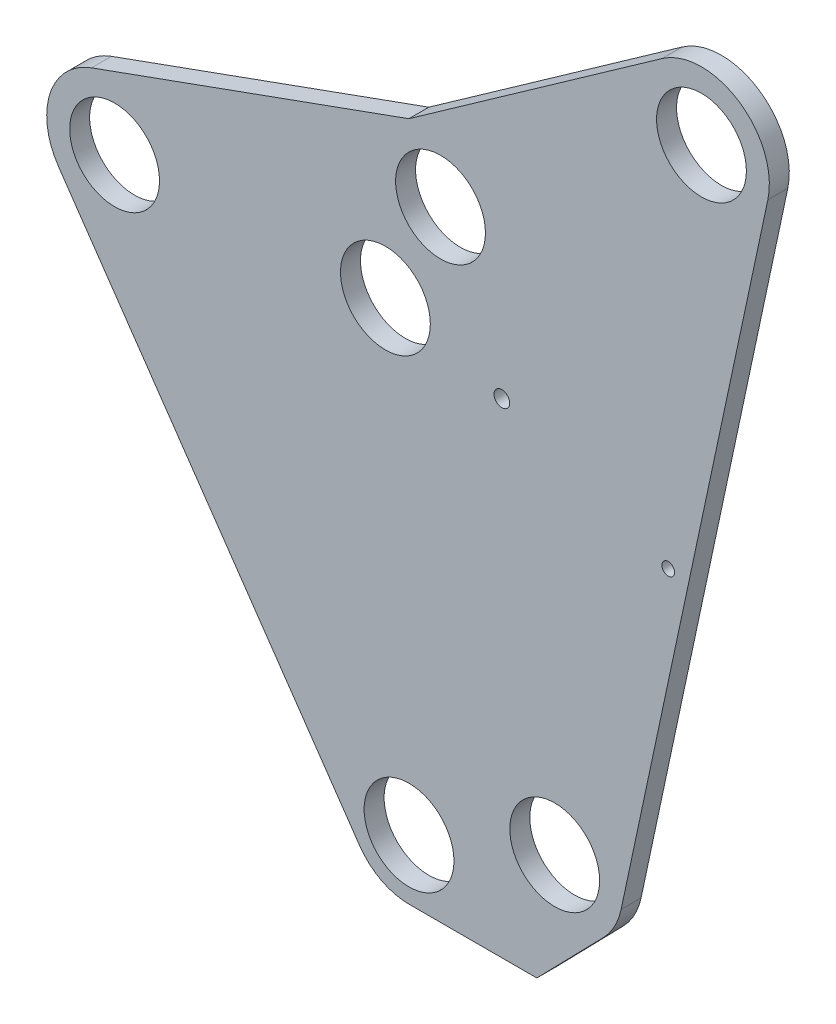
ISO-10303-21;
HEADER;
FILE_DESCRIPTION(('STEP AP214'),'2;1');
FILE_NAME('part.step','',(''),(''),'','','');
FILE_SCHEMA(('AUTOMOTIVE_DESIGN { 1 0 10303 214 1 1 1 1 }'));
ENDSEC;
DATA;
#1=APPLICATION_CONTEXT('core data for automotive mechanical design processes');
#2=APPLICATION_PROTOCOL_DEFINITION('international standard','automotive_design',2000,#1);
#3=PRODUCT_CONTEXT('',#1,'mechanical');
#4=PRODUCT('Part','Part','',(#3));
#5=PRODUCT_RELATED_PRODUCT_CATEGORY('part','',(#4));
#6=PRODUCT_DEFINITION_FORMATION('','',#4);
#7=PRODUCT_DEFINITION_CONTEXT('part definition',#1,'design');
#8=PRODUCT_DEFINITION('design','',#6,#7);
#9=PRODUCT_DEFINITION_SHAPE('','',#8);
#10=(LENGTH_UNIT() NAMED_UNIT(*) SI_UNIT(.MILLI.,.METRE.));
#11=(NAMED_UNIT(*) PLANE_ANGLE_UNIT() SI_UNIT($,.RADIAN.));
#12=(NAMED_UNIT(*) SI_UNIT($,.STERADIAN.) SOLID_ANGLE_UNIT());
#13=UNCERTAINTY_MEASURE_WITH_UNIT(LENGTH_MEASURE(1.E-05),#10,'distance_accuracy_value','');
#14=(GEOMETRIC_REPRESENTATION_CONTEXT(3) GLOBAL_UNCERTAINTY_ASSIGNED_CONTEXT((#13)) GLOBAL_UNIT_ASSIGNED_CONTEXT((#10,
#11,#12)) REPRESENTATION_CONTEXT('',''));
#15=CARTESIAN_POINT('',(0.,0.,0.));
#16=DIRECTION('',(0.,0.,1.));
#17=DIRECTION('',(1.,0.,0.));
#18=AXIS2_PLACEMENT_3D('',#15,#16,#17);
#19=CARTESIAN_POINT('',(-79.8232000394345,17.026215834079,6.35));
#20=DIRECTION('',(-0.977999669663071,0.208606438392788,0.));
#21=DIRECTION('',(-0.208606438392788,-0.977999669663071,0.));
#22=AXIS2_PLACEMENT_3D('',#19,#20,#21);
#23=PLANE('',#22);
#24=DIRECTION('',(0.208606438392788,0.977999669663071,0.));
#25=VECTOR('',#24,1.);
#26=CARTESIAN_POINT('',(-79.8232000394345,17.026215834079,0.));
#27=LINE('',#26,#25);
#28=CARTESIAN_POINT('',(-76.055367525236,34.6907662795139,0.));
#29=VERTEX_POINT('',#28);
#30=CARTESIAN_POINT('',(-29.3738193913391,253.545654010009,0.));
#31=VERTEX_POINT('',#30);
#32=EDGE_CURVE('E179',#29,#31,#27,.T.);
#33=ORIENTED_EDGE('',*,*,#32,.T.);
#34=DIRECTION('',(0.,0.,-1.));
#35=VECTOR('',#34,1.);
#36=CARTESIAN_POINT('',(-29.3738193913391,253.545654010009,6.35));
#37=LINE('',#36,#35);
#38=CARTESIAN_POINT('',(-29.3738193913391,253.545654010009,6.35));
#39=VERTEX_POINT('',#38);
#40=EDGE_CURVE('E11',#39,#31,#37,.T.);
#41=ORIENTED_EDGE('',*,*,#40,.F.);
#42=DIRECTION('',(0.208606438392788,0.977999669663071,0.));
#43=VECTOR('',#42,1.);
#44=CARTESIAN_POINT('',(-79.8232000394345,17.026215834079,6.35));
#45=LINE('',#44,#43);
#46=CARTESIAN_POINT('',(-76.055367525236,34.6907662795139,6.35));
#47=VERTEX_POINT('',#46);
#48=EDGE_CURVE('E226',#47,#39,#45,.T.);
#49=ORIENTED_EDGE('',*,*,#48,.F.);
#50=DIRECTION('',(0.,0.,-1.));
#51=VECTOR('',#50,1.);
#52=CARTESIAN_POINT('',(-76.055367525236,34.6907662795139,6.35));
#53=LINE('',#52,#51);
#54=EDGE_CURVE('E178',#47,#29,#53,.T.);
#55=ORIENTED_EDGE('',*,*,#54,.T.);
#56=EDGE_LOOP('',(#33,#41,#49,#55));
#57=FACE_BOUND('',#56,.T.);
#58=ADVANCED_FACE('F45',(#57),#23,.F.);
#59=CARTESIAN_POINT('',(-50.4888322593648,258.049467014909,6.35));
#60=DIRECTION('',(0.,0.,-1.));
#61=DIRECTION('',(-1.,0.,0.));
#62=AXIS2_PLACEMENT_3D('',#59,#60,#61);
#63=CYLINDRICAL_SURFACE('',#62,21.59);
#64=CARTESIAN_POINT('',(-50.4888322593648,258.049467014909,0.));
#65=DIRECTION('',(0.,0.,1.));
#66=DIRECTION('',(1.,0.,0.));
#67=AXIS2_PLACEMENT_3D('',#64,#65,#66);
#68=CIRCLE('',#67,21.59);
#69=CARTESIAN_POINT('',(-62.9376205522658,275.689075004843,0.));
#70=VERTEX_POINT('',#69);
#71=EDGE_CURVE('E182',#31,#70,#68,.T.);
#72=ORIENTED_EDGE('',*,*,#71,.T.);
#73=DIRECTION('',(0.,0.,-1.));
#74=VECTOR('',#73,1.);
#75=CARTESIAN_POINT('',(-62.9376205522658,275.689075004843,6.35));
#76=LINE('',#75,#74);
#77=CARTESIAN_POINT('',(-62.9376205522658,275.689075004843,6.35));
#78=VERTEX_POINT('',#77);
#79=EDGE_CURVE('E53',#78,#70,#76,.T.);
#80=ORIENTED_EDGE('',*,*,#79,.F.);
#81=CARTESIAN_POINT('',(-50.4888322593648,258.049467014909,6.35));
#82=DIRECTION('',(0.,0.,1.));
#83=DIRECTION('',(1.,0.,0.));
#84=AXIS2_PLACEMENT_3D('',#81,#82,#83);
#85=CIRCLE('',#84,21.59);
#86=EDGE_CURVE('E110',#39,#78,#85,.T.);
#87=ORIENTED_EDGE('',*,*,#86,.F.);
#88=ORIENTED_EDGE('',*,*,#40,.T.);
#89=EDGE_LOOP('',(#72,#80,#87,#88));
#90=FACE_BOUND('',#89,.T.);
#91=ADVANCED_FACE('F243',(#90),#63,.T.);
#92=CARTESIAN_POINT('',(-150.801109989484,213.681235641085,6.35));
#93=DIRECTION('',(-0.576599735660074,0.817026771187292,0.));
#94=DIRECTION('',(-0.817026771187292,-0.576599735660074,0.));
#95=AXIS2_PLACEMENT_3D('',#92,#93,#94);
#96=PLANE('',#95);
#97=DIRECTION('',(0.817026771187292,0.576599735660074,0.));
#98=VECTOR('',#97,1.);
#99=CARTESIAN_POINT('',(-150.801109989484,213.681235641085,0.));
#100=LINE('',#99,#98);
#101=CARTESIAN_POINT('',(-143.570062368403,218.784397855466,0.));
#102=VERTEX_POINT('',#101);
#103=EDGE_CURVE('E185',#102,#70,#100,.T.);
#104=ORIENTED_EDGE('',*,*,#103,.F.);
#105=DIRECTION('',(0.,0.,-1.));
#106=VECTOR('',#105,1.);
#107=CARTESIAN_POINT('',(-143.570062368403,218.784397855466,6.35));
#108=LINE('',#107,#106);
#109=CARTESIAN_POINT('',(-143.570062368403,218.784397855466,6.35));
#110=VERTEX_POINT('',#109);
#111=EDGE_CURVE('E236',#110,#102,#108,.T.);
#112=ORIENTED_EDGE('',*,*,#111,.F.);
#113=DIRECTION('',(0.817026771187292,0.576599735660074,0.));
#114=VECTOR('',#113,1.);
#115=CARTESIAN_POINT('',(-150.801109989484,213.681235641085,6.35));
#116=LINE('',#115,#114);
#117=EDGE_CURVE('E242',#110,#78,#116,.T.);
#118=ORIENTED_EDGE('',*,*,#117,.T.);
#119=ORIENTED_EDGE('',*,*,#79,.T.);
#120=EDGE_LOOP('',(#104,#112,#118,#119));
#121=FACE_BOUND('',#120,.T.);
#122=ADVANCED_FACE('F240',(#121),#96,.T.);
#123=CARTESIAN_POINT('',(-86.473122523091,239.407597481835,6.35));
#124=DIRECTION('',(-0.339715287383472,0.940528321486368,0.));
#125=DIRECTION('',(-0.940528321486368,-0.339715287383472,0.));
#126=AXIS2_PLACEMENT_3D('',#123,#124,#125);
#127=PLANE('',#126);
#128=DIRECTION('',(0.940528321486368,0.339715287383472,0.));
#129=VECTOR('',#128,1.);
#130=CARTESIAN_POINT('',(-86.473122523091,239.407597481835,0.));
#131=LINE('',#130,#129);
#132=CARTESIAN_POINT('',(-244.513285313974,182.324085912732,0.));
#133=VERTEX_POINT('',#132);
#134=EDGE_CURVE('E188',#133,#102,#131,.T.);
#135=ORIENTED_EDGE('',*,*,#134,.F.);
#136=DIRECTION('',(0.,0.,-1.));
#137=VECTOR('',#136,1.);
#138=CARTESIAN_POINT('',(-244.513285313974,182.324085912732,6.35));
#139=LINE('',#138,#137);
#140=CARTESIAN_POINT('',(-244.513285313974,182.324085912732,6.35));
#141=VERTEX_POINT('',#140);
#142=EDGE_CURVE('E234',#141,#133,#139,.T.);
#143=ORIENTED_EDGE('',*,*,#142,.F.);
#144=DIRECTION('',(0.940528321486368,0.339715287383472,0.));
#145=VECTOR('',#144,1.);
#146=CARTESIAN_POINT('',(-86.473122523091,239.407597481835,6.35));
#147=LINE('',#146,#145);
#148=EDGE_CURVE('E256',#141,#110,#147,.T.);
#149=ORIENTED_EDGE('',*,*,#148,.T.);
#150=ORIENTED_EDGE('',*,*,#111,.T.);
#151=EDGE_LOOP('',(#135,#143,#149,#150));
#152=FACE_BOUND('',#151,.T.);
#153=ADVANCED_FACE('F252',(#152),#127,.T.);
#154=CARTESIAN_POINT('',(-237.178832259365,162.018079451841,6.35));
#155=DIRECTION('',(0.,0.,-1.));
#156=DIRECTION('',(-1.,0.,0.));
#157=AXIS2_PLACEMENT_3D('',#154,#155,#156);
#158=CYLINDRICAL_SURFACE('',#157,21.59);
#159=CARTESIAN_POINT('',(-237.178832259365,162.018079451841,0.));
#160=DIRECTION('',(0.,0.,1.));
#161=DIRECTION('',(1.,0.,0.));
#162=AXIS2_PLACEMENT_3D('',#159,#160,#161);
#163=CIRCLE('',#162,21.59);
#164=CARTESIAN_POINT('',(-254.963115404504,149.776863294388,0.));
#165=VERTEX_POINT('',#164);
#166=EDGE_CURVE('E191',#133,#165,#163,.T.);
#167=ORIENTED_EDGE('',*,*,#166,.T.);
#168=DIRECTION('',(0.,0.,-1.));
#169=VECTOR('',#168,1.);
#170=CARTESIAN_POINT('',(-254.963115404504,149.776863294388,6.35));
#171=LINE('',#170,#169);
#172=CARTESIAN_POINT('',(-254.963115404504,149.776863294388,6.35));
#173=VERTEX_POINT('',#172);
#174=EDGE_CURVE('E232',#173,#165,#171,.T.);
#175=ORIENTED_EDGE('',*,*,#174,.F.);
#176=CARTESIAN_POINT('',(-237.178832259365,162.018079451841,6.35));
#177=DIRECTION('',(0.,0.,1.));
#178=DIRECTION('',(1.,0.,0.));
#179=AXIS2_PLACEMENT_3D('',#176,#177,#178);
#180=CIRCLE('',#179,21.59);
#181=EDGE_CURVE('E258',#141,#173,#180,.T.);
#182=ORIENTED_EDGE('',*,*,#181,.F.);
#183=ORIENTED_EDGE('',*,*,#142,.T.);
#184=EDGE_LOOP('',(#167,#175,#182,#183));
#185=FACE_BOUND('',#184,.T.);
#186=ADVANCED_FACE('F271',(#185),#158,.T.);
#187=CARTESIAN_POINT('',(-103.047442339974,-70.9292584841203,6.35));
#188=DIRECTION('',(-0.823727797366348,-0.566985463522642,0.));
#189=DIRECTION('',(0.566985463522642,-0.823727797366348,0.));
#190=AXIS2_PLACEMENT_3D('',#187,#188,#189);
#191=PLANE('',#190);
#192=DIRECTION('',(-0.566985463522642,0.823727797366348,0.));
#193=VECTOR('',#192,1.);
#194=CARTESIAN_POINT('',(-103.047442339974,-70.9292584841203,0.));
#195=LINE('',#194,#193);
#196=CARTESIAN_POINT('',(-159.204429516546,10.6567332735686,0.));
#197=VERTEX_POINT('',#196);
#198=EDGE_CURVE('E194',#197,#165,#195,.T.);
#199=ORIENTED_EDGE('',*,*,#198,.F.);
#200=DIRECTION('',(0.,0.,-1.));
#201=VECTOR('',#200,1.);
#202=CARTESIAN_POINT('',(-159.204429516546,10.6567332735686,6.35));
#203=LINE('',#202,#201);
#204=CARTESIAN_POINT('',(-159.204429516546,10.6567332735686,6.35));
#205=VERTEX_POINT('',#204);
#206=EDGE_CURVE('E230',#205,#197,#203,.T.);
#207=ORIENTED_EDGE('',*,*,#206,.F.);
#208=DIRECTION('',(-0.566985463522642,0.823727797366348,0.));
#209=VECTOR('',#208,1.);
#210=CARTESIAN_POINT('',(-103.047442339974,-70.9292584841203,6.35));
#211=LINE('',#210,#209);
#212=EDGE_CURVE('E264',#205,#173,#211,.T.);
#213=ORIENTED_EDGE('',*,*,#212,.T.);
#214=ORIENTED_EDGE('',*,*,#174,.T.);
#215=EDGE_LOOP('',(#199,#207,#213,#214));
#216=FACE_BOUND('',#215,.T.);
#217=ADVANCED_FACE('F268',(#216),#191,.T.);
#218=CARTESIAN_POINT('',(-143.512414976717,21.4578063536749,6.35));
#219=DIRECTION('',(0.,0.,-1.));
#220=DIRECTION('',(-1.,0.,0.));
#221=AXIS2_PLACEMENT_3D('',#218,#219,#220);
#222=CYLINDRICAL_SURFACE('',#221,19.05);
#223=CARTESIAN_POINT('',(-143.512414976717,21.4578063536749,0.));
#224=DIRECTION('',(0.,0.,1.));
#225=DIRECTION('',(1.,0.,0.));
#226=AXIS2_PLACEMENT_3D('',#223,#224,#225);
#227=CIRCLE('',#226,19.05);
#228=CARTESIAN_POINT('',(-143.512414976717,2.4078063536749,0.));
#229=VERTEX_POINT('',#228);
#230=EDGE_CURVE('E197',#197,#229,#227,.T.);
#231=ORIENTED_EDGE('',*,*,#230,.T.);
#232=DIRECTION('',(0.,0.,-1.));
#233=VECTOR('',#232,1.);
#234=CARTESIAN_POINT('',(-143.512414976717,2.4078063536749,6.35));
#235=LINE('',#234,#233);
#236=CARTESIAN_POINT('',(-143.512414976717,2.4078063536749,6.35));
#237=VERTEX_POINT('',#236);
#238=EDGE_CURVE('E146',#237,#229,#235,.T.);
#239=ORIENTED_EDGE('',*,*,#238,.F.);
#240=CARTESIAN_POINT('',(-143.512414976717,21.4578063536749,6.35));
#241=DIRECTION('',(0.,0.,1.));
#242=DIRECTION('',(1.,0.,0.));
#243=AXIS2_PLACEMENT_3D('',#240,#241,#242);
#244=CIRCLE('',#243,19.05);
#245=EDGE_CURVE('E137',#205,#237,#244,.T.);
#246=ORIENTED_EDGE('',*,*,#245,.F.);
#247=ORIENTED_EDGE('',*,*,#206,.T.);
#248=EDGE_LOOP('',(#231,#239,#246,#247));
#249=FACE_BOUND('',#248,.T.);
#250=ADVANCED_FACE('F274',(#249),#222,.T.);
#251=CARTESIAN_POINT('',(0.,2.40780635367491,6.35));
#252=DIRECTION('',(0.,1.,0.));
#253=DIRECTION('',(0.,0.,1.));
#254=AXIS2_PLACEMENT_3D('',#251,#252,#253);
#255=PLANE('',#254);
#256=DIRECTION('',(1.,0.,0.));
#257=VECTOR('',#256,1.);
#258=CARTESIAN_POINT('',(0.,2.40780635367491,0.));
#259=LINE('',#258,#257);
#260=CARTESIAN_POINT('',(-102.872414976717,2.40780635367491,0.));
#261=VERTEX_POINT('',#260);
#262=EDGE_CURVE('E145',#229,#261,#259,.T.);
#263=ORIENTED_EDGE('',*,*,#262,.T.);
#264=DIRECTION('',(0.,0.,-1.));
#265=VECTOR('',#264,1.);
#266=CARTESIAN_POINT('',(-102.872414976717,2.40780635367491,6.35));
#267=LINE('',#266,#265);
#268=CARTESIAN_POINT('',(-102.872414976717,2.40780635367491,6.35));
#269=VERTEX_POINT('',#268);
#270=EDGE_CURVE('E142',#269,#261,#267,.T.);
#271=ORIENTED_EDGE('',*,*,#270,.F.);
#272=DIRECTION('',(1.,0.,0.));
#273=VECTOR('',#272,1.);
#274=CARTESIAN_POINT('',(0.,2.40780635367491,6.35));
#275=LINE('',#274,#273);
#276=EDGE_CURVE('E129',#237,#269,#275,.T.);
#277=ORIENTED_EDGE('',*,*,#276,.F.);
#278=ORIENTED_EDGE('',*,*,#238,.T.);
#279=EDGE_LOOP('',(#263,#271,#277,#278));
#280=FACE_BOUND('',#279,.T.);
#281=ADVANCED_FACE('F143',(#280),#255,.F.);
#282=CARTESIAN_POINT('',(-53.9694705171365,52.5917947668966,6.35));
#283=DIRECTION('',(-0.71618874935704,0.697906637949804,0.));
#284=DIRECTION('',(-0.697906637949804,-0.71618874935704,0.));
#285=AXIS2_PLACEMENT_3D('',#282,#283,#284);
#286=PLANE('',#285);
#287=DIRECTION('',(0.697906637949804,0.71618874935704,0.));
#288=VECTOR('',#287,1.);
#289=CARTESIAN_POINT('',(-53.9694705171365,52.5917947668966,0.));
#290=LINE('',#289,#288);
#291=CARTESIAN_POINT('',(-81.7078652946437,24.1267749710775,0.));
#292=VERTEX_POINT('',#291);
#293=EDGE_CURVE('E96',#261,#292,#290,.T.);
#294=ORIENTED_EDGE('',*,*,#293,.T.);
#295=DIRECTION('',(0.,0.,-1.));
#296=VECTOR('',#295,1.);
#297=CARTESIAN_POINT('',(-81.7078652946437,24.1267749710775,6.35));
#298=LINE('',#297,#296);
#299=CARTESIAN_POINT('',(-81.7078652946437,24.1267749710775,6.35));
#300=VERTEX_POINT('',#299);
#301=EDGE_CURVE('E147',#300,#292,#298,.T.);
#302=ORIENTED_EDGE('',*,*,#301,.F.);
#303=DIRECTION('',(0.697906637949804,0.71618874935704,0.));
#304=VECTOR('',#303,1.);
#305=CARTESIAN_POINT('',(-53.9694705171365,52.5917947668966,6.35));
#306=LINE('',#305,#304);
#307=EDGE_CURVE('E134',#269,#300,#306,.T.);
#308=ORIENTED_EDGE('',*,*,#307,.F.);
#309=ORIENTED_EDGE('',*,*,#270,.T.);
#310=EDGE_LOOP('',(#294,#302,#308,#309));
#311=FACE_BOUND('',#310,.T.);
#312=ADVANCED_FACE('F149',(#311),#286,.F.);
#313=CARTESIAN_POINT('',(-50.4888322593648,258.049467014909,6.35));
#314=DIRECTION('',(0.,0.,-1.));
#315=DIRECTION('',(-1.,0.,0.));
#316=AXIS2_PLACEMENT_3D('',#313,#314,#315);
#317=CYLINDRICAL_SURFACE('',#316,14.2874999999999);
#318=CARTESIAN_POINT('',(-50.4888322593648,258.049467014909,6.35));
#319=DIRECTION('',(0.,0.,1.));
#320=DIRECTION('',(1.,0.,0.));
#321=AXIS2_PLACEMENT_3D('',#318,#319,#320);
#322=CIRCLE('',#321,14.2874999999999);
#323=CARTESIAN_POINT('',(-36.2013322593648,258.049467014909,6.35));
#324=VERTEX_POINT('',#323);
#325=EDGE_CURVE('E172',#324,#324,#322,.T.);
#326=ORIENTED_EDGE('',*,*,#325,.T.);
#327=EDGE_LOOP('',(#326));
#328=FACE_BOUND('',#327,.T.);
#329=CARTESIAN_POINT('',(-50.4888322593648,258.049467014909,0.));
#330=DIRECTION('',(0.,0.,1.));
#331=DIRECTION('',(1.,0.,0.));
#332=AXIS2_PLACEMENT_3D('',#329,#330,#331);
#333=CIRCLE('',#332,14.2874999999999);
#334=CARTESIAN_POINT('',(-36.2013322593648,258.049467014909,0.));
#335=VERTEX_POINT('',#334);
#336=EDGE_CURVE('E220',#335,#335,#333,.T.);
#337=ORIENTED_EDGE('',*,*,#336,.F.);
#338=EDGE_LOOP('',(#337));
#339=FACE_BOUND('',#338,.T.);
#340=ADVANCED_FACE('F306',(#328,#339),#317,.F.);
#341=CARTESIAN_POINT('',(-133.498752211994,199.466933871846,6.35));
#342=DIRECTION('',(0.,0.,-1.));
#343=DIRECTION('',(-1.,0.,0.));
#344=AXIS2_PLACEMENT_3D('',#341,#342,#343);
#345=CYLINDRICAL_SURFACE('',#344,14.2875);
#346=CARTESIAN_POINT('',(-133.498752211994,199.466933871846,6.35));
#347=DIRECTION('',(0.,0.,1.));
#348=DIRECTION('',(1.,0.,0.));
#349=AXIS2_PLACEMENT_3D('',#346,#347,#348);
#350=CIRCLE('',#349,14.2875);
#351=CARTESIAN_POINT('',(-119.211252211994,199.466933871846,6.35));
#352=VERTEX_POINT('',#351);
#353=EDGE_CURVE('E169',#352,#352,#350,.T.);
#354=ORIENTED_EDGE('',*,*,#353,.T.);
#355=EDGE_LOOP('',(#354));
#356=FACE_BOUND('',#355,.T.);
#357=CARTESIAN_POINT('',(-133.498752211994,199.466933871846,0.));
#358=DIRECTION('',(0.,0.,1.));
#359=DIRECTION('',(1.,0.,0.));
#360=AXIS2_PLACEMENT_3D('',#357,#358,#359);
#361=CIRCLE('',#360,14.2875);
#362=CARTESIAN_POINT('',(-119.211252211994,199.466933871846,0.));
#363=VERTEX_POINT('',#362);
#364=EDGE_CURVE('E217',#363,#363,#361,.T.);
#365=ORIENTED_EDGE('',*,*,#364,.F.);
#366=EDGE_LOOP('',(#365));
#367=FACE_BOUND('',#366,.T.);
#368=ADVANCED_FACE('F310',(#356,#367),#345,.F.);
#369=CARTESIAN_POINT('',(-237.178832259365,162.018079451841,6.35));
#370=DIRECTION('',(0.,0.,-1.));
#371=DIRECTION('',(-1.,0.,0.));
#372=AXIS2_PLACEMENT_3D('',#369,#370,#371);
#373=CYLINDRICAL_SURFACE('',#372,14.2875);
#374=CARTESIAN_POINT('',(-237.178832259365,162.018079451841,6.35));
#375=DIRECTION('',(0.,0.,1.));
#376=DIRECTION('',(1.,0.,0.));
#377=AXIS2_PLACEMENT_3D('',#374,#375,#376);
#378=CIRCLE('',#377,14.2875);
#379=CARTESIAN_POINT('',(-222.891332259365,162.018079451841,6.35));
#380=VERTEX_POINT('',#379);
#381=EDGE_CURVE('E166',#380,#380,#378,.T.);
#382=ORIENTED_EDGE('',*,*,#381,.T.);
#383=EDGE_LOOP('',(#382));
#384=FACE_BOUND('',#383,.T.);
#385=CARTESIAN_POINT('',(-237.178832259365,162.018079451841,0.));
#386=DIRECTION('',(0.,0.,1.));
#387=DIRECTION('',(1.,0.,0.));
#388=AXIS2_PLACEMENT_3D('',#385,#386,#387);
#389=CIRCLE('',#388,14.2875);
#390=CARTESIAN_POINT('',(-222.891332259365,162.018079451841,0.));
#391=VERTEX_POINT('',#390);
#392=EDGE_CURVE('E214',#391,#391,#389,.T.);
#393=ORIENTED_EDGE('',*,*,#392,.F.);
#394=EDGE_LOOP('',(#393));
#395=FACE_BOUND('',#394,.T.);
#396=ADVANCED_FACE('F316',(#384,#395),#373,.F.);
#397=CARTESIAN_POINT('',(-143.512414976717,21.4578063536749,6.35));
#398=DIRECTION('',(0.,0.,-1.));
#399=DIRECTION('',(-1.,0.,0.));
#400=AXIS2_PLACEMENT_3D('',#397,#398,#399);
#401=CYLINDRICAL_SURFACE('',#400,14.2875);
#402=CARTESIAN_POINT('',(-143.512414976717,21.4578063536749,6.35));
#403=DIRECTION('',(0.,0.,1.));
#404=DIRECTION('',(1.,0.,0.));
#405=AXIS2_PLACEMENT_3D('',#402,#403,#404);
#406=CIRCLE('',#405,14.2875);
#407=CARTESIAN_POINT('',(-129.224914976717,21.4578063536749,6.35));
#408=VERTEX_POINT('',#407);
#409=EDGE_CURVE('E163',#408,#408,#406,.T.);
#410=ORIENTED_EDGE('',*,*,#409,.T.);
#411=EDGE_LOOP('',(#410));
#412=FACE_BOUND('',#411,.T.);
#413=CARTESIAN_POINT('',(-143.512414976717,21.4578063536749,0.));
#414=DIRECTION('',(0.,0.,1.));
#415=DIRECTION('',(1.,0.,0.));
#416=AXIS2_PLACEMENT_3D('',#413,#414,#415);
#417=CIRCLE('',#416,14.2875);
#418=CARTESIAN_POINT('',(-129.224914976717,21.4578063536749,0.));
#419=VERTEX_POINT('',#418);
#420=EDGE_CURVE('E211',#419,#419,#417,.T.);
#421=ORIENTED_EDGE('',*,*,#420,.F.);
#422=EDGE_LOOP('',(#421));
#423=FACE_BOUND('',#422,.T.);
#424=ADVANCED_FACE('F324',(#412,#423),#401,.F.);
#425=CARTESIAN_POINT('',(-97.1703803932617,39.1945792844141,6.35));
#426=DIRECTION('',(0.,0.,-1.));
#427=DIRECTION('',(-1.,0.,0.));
#428=AXIS2_PLACEMENT_3D('',#425,#426,#427);
#429=CYLINDRICAL_SURFACE('',#428,14.2875);
#430=CARTESIAN_POINT('',(-97.1703803932617,39.1945792844141,6.35));
#431=DIRECTION('',(0.,0.,1.));
#432=DIRECTION('',(1.,0.,0.));
#433=AXIS2_PLACEMENT_3D('',#430,#431,#432);
#434=CIRCLE('',#433,14.2875);
#435=CARTESIAN_POINT('',(-82.8828803932617,39.1945792844141,6.35));
#436=VERTEX_POINT('',#435);
#437=EDGE_CURVE('E160',#436,#436,#434,.T.);
#438=ORIENTED_EDGE('',*,*,#437,.T.);
#439=EDGE_LOOP('',(#438));
#440=FACE_BOUND('',#439,.T.);
#441=CARTESIAN_POINT('',(-97.1703803932617,39.1945792844141,0.));
#442=DIRECTION('',(0.,0.,1.));
#443=DIRECTION('',(1.,0.,0.));
#444=AXIS2_PLACEMENT_3D('',#441,#442,#443);
#445=CIRCLE('',#444,14.2875);
#446=CARTESIAN_POINT('',(-82.8828803932617,39.1945792844141,0.));
#447=VERTEX_POINT('',#446);
#448=EDGE_CURVE('E208',#447,#447,#445,.T.);
#449=ORIENTED_EDGE('',*,*,#448,.F.);
#450=EDGE_LOOP('',(#449));
#451=FACE_BOUND('',#450,.T.);
#452=ADVANCED_FACE('F328',(#440,#451),#429,.F.);
#453=CARTESIAN_POINT('',(-151.027915739059,165.638862303377,6.35));
#454=DIRECTION('',(0.,0.,-1.));
#455=DIRECTION('',(-1.,0.,0.));
#456=AXIS2_PLACEMENT_3D('',#453,#454,#455);
#457=CYLINDRICAL_SURFACE('',#456,14.2875);
#458=CARTESIAN_POINT('',(-151.027915739059,165.638862303377,6.35));
#459=DIRECTION('',(0.,0.,1.));
#460=DIRECTION('',(1.,0.,0.));
#461=AXIS2_PLACEMENT_3D('',#458,#459,#460);
#462=CIRCLE('',#461,14.2875);
#463=CARTESIAN_POINT('',(-136.740415739059,165.638862303377,6.35));
#464=VERTEX_POINT('',#463);
#465=EDGE_CURVE('E157',#464,#464,#462,.T.);
#466=ORIENTED_EDGE('',*,*,#465,.T.);
#467=EDGE_LOOP('',(#466));
#468=FACE_BOUND('',#467,.T.);
#469=CARTESIAN_POINT('',(-151.027915739059,165.638862303377,0.));
#470=DIRECTION('',(0.,0.,1.));
#471=DIRECTION('',(1.,0.,0.));
#472=AXIS2_PLACEMENT_3D('',#469,#470,#471);
#473=CIRCLE('',#472,14.2875);
#474=CARTESIAN_POINT('',(-136.740415739059,165.638862303377,0.));
#475=VERTEX_POINT('',#474);
#476=EDGE_CURVE('E205',#475,#475,#473,.T.);
#477=ORIENTED_EDGE('',*,*,#476,.F.);
#478=EDGE_LOOP('',(#477));
#479=FACE_BOUND('',#478,.T.);
#480=ADVANCED_FACE('F300',(#468,#479),#457,.F.);
#481=CARTESIAN_POINT('',(-61.0722104297151,136.043251817327,6.35));
#482=DIRECTION('',(0.,0.,-1.));
#483=DIRECTION('',(-1.,0.,0.));
#484=AXIS2_PLACEMENT_3D('',#481,#482,#483);
#485=CYLINDRICAL_SURFACE('',#484,2.01930000000049);
#486=CARTESIAN_POINT('',(-61.0722104297151,136.043251817327,6.35));
#487=DIRECTION('',(0.,0.,1.));
#488=DIRECTION('',(1.,0.,0.));
#489=AXIS2_PLACEMENT_3D('',#486,#487,#488);
#490=CIRCLE('',#489,2.01930000000049);
#491=CARTESIAN_POINT('',(-59.0529104297147,136.043251817327,6.35));
#492=VERTEX_POINT('',#491);
#493=EDGE_CURVE('E151',#492,#492,#490,.T.);
#494=ORIENTED_EDGE('',*,*,#493,.T.);
#495=EDGE_LOOP('',(#494));
#496=FACE_BOUND('',#495,.T.);
#497=CARTESIAN_POINT('',(-61.0722104297151,136.043251817327,0.));
#498=DIRECTION('',(0.,0.,1.));
#499=DIRECTION('',(1.,0.,0.));
#500=AXIS2_PLACEMENT_3D('',#497,#498,#499);
#501=CIRCLE('',#500,2.01930000000049);
#502=CARTESIAN_POINT('',(-59.0529104297147,136.043251817327,0.));
#503=VERTEX_POINT('',#502);
#504=EDGE_CURVE('E202',#503,#503,#501,.T.);
#505=ORIENTED_EDGE('',*,*,#504,.F.);
#506=EDGE_LOOP('',(#505));
#507=FACE_BOUND('',#506,.T.);
#508=ADVANCED_FACE('F292',(#496,#507),#485,.F.);
#509=CARTESIAN_POINT('',(-97.1703803932617,39.1945792844141,6.35));
#510=DIRECTION('',(0.,0.,-1.));
#511=DIRECTION('',(-1.,0.,0.));
#512=AXIS2_PLACEMENT_3D('',#509,#510,#511);
#513=CYLINDRICAL_SURFACE('',#512,21.59);
#514=CARTESIAN_POINT('',(-97.1703803932617,39.1945792844141,0.));
#515=DIRECTION('',(0.,0.,1.));
#516=DIRECTION('',(1.,0.,0.));
#517=AXIS2_PLACEMENT_3D('',#514,#515,#516);
#518=CIRCLE('',#517,21.59);
#519=EDGE_CURVE('E102',#292,#29,#518,.T.);
#520=ORIENTED_EDGE('',*,*,#519,.T.);
#521=ORIENTED_EDGE('',*,*,#54,.F.);
#522=CARTESIAN_POINT('',(-97.1703803932617,39.1945792844141,6.35));
#523=DIRECTION('',(0.,0.,1.));
#524=DIRECTION('',(1.,0.,0.));
#525=AXIS2_PLACEMENT_3D('',#522,#523,#524);
#526=CIRCLE('',#525,21.59);
#527=EDGE_CURVE('E61',#300,#47,#526,.T.);
#528=ORIENTED_EDGE('',*,*,#527,.F.);
#529=ORIENTED_EDGE('',*,*,#301,.T.);
#530=EDGE_LOOP('',(#520,#521,#528,#529));
#531=FACE_BOUND('',#530,.T.);
#532=ADVANCED_FACE('F289',(#531),#513,.T.);
#533=CARTESIAN_POINT('',(-113.988832259365,156.449467014909,6.35));
#534=DIRECTION('',(0.,0.,-1.));
#535=DIRECTION('',(-1.,0.,0.));
#536=AXIS2_PLACEMENT_3D('',#533,#534,#535);
#537=CYLINDRICAL_SURFACE('',#536,2.48920000000003);
#538=CARTESIAN_POINT('',(-113.988832259365,156.449467014909,6.35));
#539=DIRECTION('',(0.,0.,1.));
#540=DIRECTION('',(1.,0.,0.));
#541=AXIS2_PLACEMENT_3D('',#538,#539,#540);
#542=CIRCLE('',#541,2.48920000000003);
#543=CARTESIAN_POINT('',(-111.499632259365,156.449467014909,6.35));
#544=VERTEX_POINT('',#543);
#545=EDGE_CURVE('E175',#544,#544,#542,.T.);
#546=ORIENTED_EDGE('',*,*,#545,.T.);
#547=EDGE_LOOP('',(#546));
#548=FACE_BOUND('',#547,.T.);
#549=CARTESIAN_POINT('',(-113.988832259365,156.449467014909,0.));
#550=DIRECTION('',(0.,0.,1.));
#551=DIRECTION('',(1.,0.,0.));
#552=AXIS2_PLACEMENT_3D('',#549,#550,#551);
#553=CIRCLE('',#552,2.48920000000003);
#554=CARTESIAN_POINT('',(-111.499632259365,156.449467014909,0.));
#555=VERTEX_POINT('',#554);
#556=EDGE_CURVE('E223',#555,#555,#553,.T.);
#557=ORIENTED_EDGE('',*,*,#556,.F.);
#558=EDGE_LOOP('',(#557));
#559=FACE_BOUND('',#558,.T.);
#560=ADVANCED_FACE('F291',(#548,#559),#537,.F.);
#561=CARTESIAN_POINT('',(0.,0.,6.35));
#562=DIRECTION('',(0.,0.,1.));
#563=DIRECTION('',(1.,0.,0.));
#564=AXIS2_PLACEMENT_3D('',#561,#562,#563);
#565=PLANE('',#564);
#566=ORIENTED_EDGE('',*,*,#48,.T.);
#567=ORIENTED_EDGE('',*,*,#86,.T.);
#568=ORIENTED_EDGE('',*,*,#117,.F.);
#569=ORIENTED_EDGE('',*,*,#148,.F.);
#570=ORIENTED_EDGE('',*,*,#181,.T.);
#571=ORIENTED_EDGE('',*,*,#212,.F.);
#572=ORIENTED_EDGE('',*,*,#245,.T.);
#573=ORIENTED_EDGE('',*,*,#276,.T.);
#574=ORIENTED_EDGE('',*,*,#307,.T.);
#575=ORIENTED_EDGE('',*,*,#527,.T.);
#576=EDGE_LOOP('',(#566,#567,#568,#569,#570,#571,#572,#573,#574,#575));
#577=FACE_BOUND('',#576,.T.);
#578=ORIENTED_EDGE('',*,*,#493,.F.);
#579=EDGE_LOOP('',(#578));
#580=FACE_BOUND('',#579,.T.);
#581=ORIENTED_EDGE('',*,*,#465,.F.);
#582=EDGE_LOOP('',(#581));
#583=FACE_BOUND('',#582,.T.);
#584=ORIENTED_EDGE('',*,*,#437,.F.);
#585=EDGE_LOOP('',(#584));
#586=FACE_BOUND('',#585,.T.);
#587=ORIENTED_EDGE('',*,*,#409,.F.);
#588=EDGE_LOOP('',(#587));
#589=FACE_BOUND('',#588,.T.);
#590=ORIENTED_EDGE('',*,*,#381,.F.);
#591=EDGE_LOOP('',(#590));
#592=FACE_BOUND('',#591,.T.);
#593=ORIENTED_EDGE('',*,*,#353,.F.);
#594=EDGE_LOOP('',(#593));
#595=FACE_BOUND('',#594,.T.);
#596=ORIENTED_EDGE('',*,*,#325,.F.);
#597=EDGE_LOOP('',(#596));
#598=FACE_BOUND('',#597,.T.);
#599=ORIENTED_EDGE('',*,*,#545,.F.);
#600=EDGE_LOOP('',(#599));
#601=FACE_BOUND('',#600,.T.);
#602=ADVANCED_FACE('F131',(#577,#580,#583,#586,#589,#592,#595,#598,#601),#565,.T.);
#603=CARTESIAN_POINT('',(0.,0.,0.));
#604=DIRECTION('',(0.,0.,1.));
#605=DIRECTION('',(1.,0.,0.));
#606=AXIS2_PLACEMENT_3D('',#603,#604,#605);
#607=PLANE('',#606);
#608=ORIENTED_EDGE('',*,*,#32,.F.);
#609=ORIENTED_EDGE('',*,*,#519,.F.);
#610=ORIENTED_EDGE('',*,*,#293,.F.);
#611=ORIENTED_EDGE('',*,*,#262,.F.);
#612=ORIENTED_EDGE('',*,*,#230,.F.);
#613=ORIENTED_EDGE('',*,*,#198,.T.);
#614=ORIENTED_EDGE('',*,*,#166,.F.);
#615=ORIENTED_EDGE('',*,*,#134,.T.);
#616=ORIENTED_EDGE('',*,*,#103,.T.);
#617=ORIENTED_EDGE('',*,*,#71,.F.);
#618=EDGE_LOOP('',(#608,#609,#610,#611,#612,#613,#614,#615,#616,#617));
#619=FACE_BOUND('',#618,.T.);
#620=ORIENTED_EDGE('',*,*,#504,.T.);
#621=EDGE_LOOP('',(#620));
#622=FACE_BOUND('',#621,.T.);
#623=ORIENTED_EDGE('',*,*,#476,.T.);
#624=EDGE_LOOP('',(#623));
#625=FACE_BOUND('',#624,.T.);
#626=ORIENTED_EDGE('',*,*,#448,.T.);
#627=EDGE_LOOP('',(#626));
#628=FACE_BOUND('',#627,.T.);
#629=ORIENTED_EDGE('',*,*,#420,.T.);
#630=EDGE_LOOP('',(#629));
#631=FACE_BOUND('',#630,.T.);
#632=ORIENTED_EDGE('',*,*,#392,.T.);
#633=EDGE_LOOP('',(#632));
#634=FACE_BOUND('',#633,.T.);
#635=ORIENTED_EDGE('',*,*,#364,.T.);
#636=EDGE_LOOP('',(#635));
#637=FACE_BOUND('',#636,.T.);
#638=ORIENTED_EDGE('',*,*,#336,.T.);
#639=EDGE_LOOP('',(#638));
#640=FACE_BOUND('',#639,.T.);
#641=ORIENTED_EDGE('',*,*,#556,.T.);
#642=EDGE_LOOP('',(#641));
#643=FACE_BOUND('',#642,.T.);
#644=ADVANCED_FACE('F247',(#619,#622,#625,#628,#631,#634,#637,#640,#643),#607,.F.);
#645=CLOSED_SHELL('',(#58,#91,#122,#153,#186,#217,#250,#281,#312,#340,#368,#396,#424,#452,#480,
#508,#532,#560,#602,#644));
#646=MANIFOLD_SOLID_BREP('B2',#645);
#647=ADVANCED_BREP_SHAPE_REPRESENTATION('',(#18,#646),#14);
#648=SHAPE_DEFINITION_REPRESENTATION(#9,#647);
ENDSEC;
END-ISO-10303-21;
